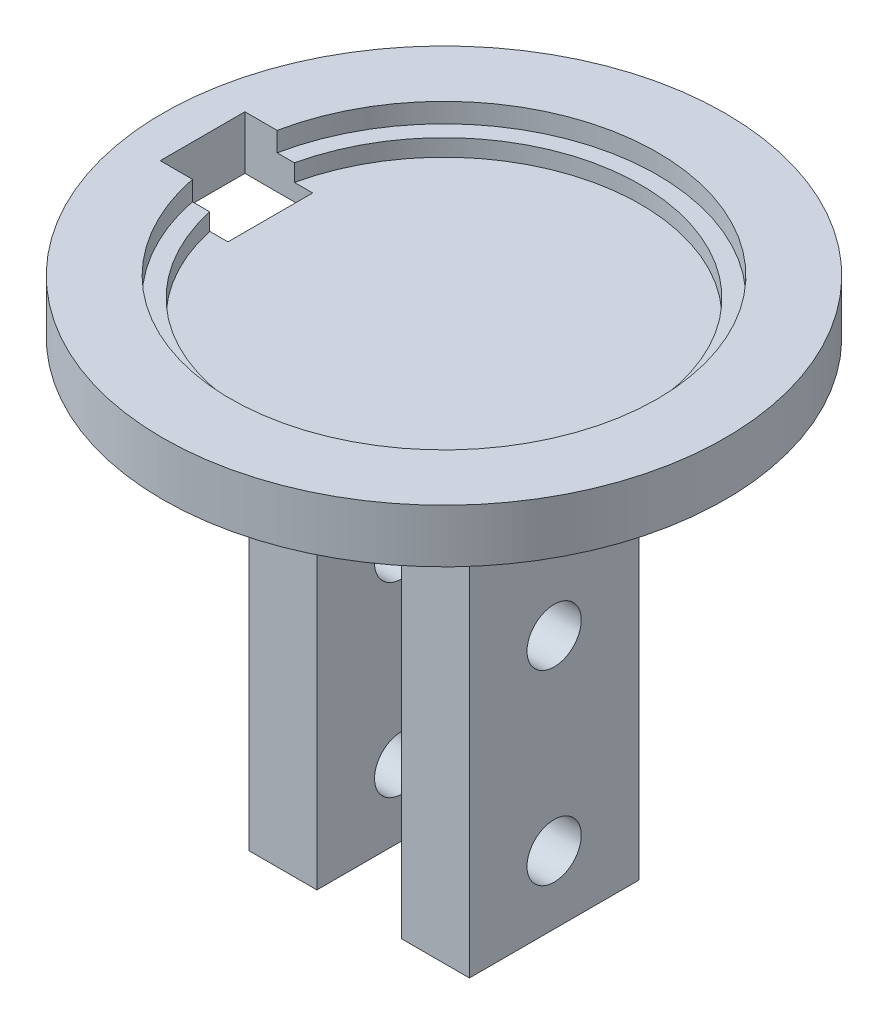
ISO-10303-21;
HEADER;
FILE_DESCRIPTION(('STEP AP214'),'2;1');
FILE_NAME('part.step','',(''),(''),'','','');
FILE_SCHEMA(('AUTOMOTIVE_DESIGN { 1 0 10303 214 1 1 1 1 }'));
ENDSEC;
DATA;
#1=APPLICATION_CONTEXT('core data for automotive mechanical design processes');
#2=APPLICATION_PROTOCOL_DEFINITION('international standard','automotive_design',2000,#1);
#3=PRODUCT_CONTEXT('',#1,'mechanical');
#4=PRODUCT('Part','Part','',(#3));
#5=PRODUCT_RELATED_PRODUCT_CATEGORY('part','',(#4));
#6=PRODUCT_DEFINITION_FORMATION('','',#4);
#7=PRODUCT_DEFINITION_CONTEXT('part definition',#1,'design');
#8=PRODUCT_DEFINITION('design','',#6,#7);
#9=PRODUCT_DEFINITION_SHAPE('','',#8);
#10=(LENGTH_UNIT() NAMED_UNIT(*) SI_UNIT(.MILLI.,.METRE.));
#11=(NAMED_UNIT(*) PLANE_ANGLE_UNIT() SI_UNIT($,.RADIAN.));
#12=(NAMED_UNIT(*) SI_UNIT($,.STERADIAN.) SOLID_ANGLE_UNIT());
#13=UNCERTAINTY_MEASURE_WITH_UNIT(LENGTH_MEASURE(1.E-05),#10,'distance_accuracy_value','');
#14=(GEOMETRIC_REPRESENTATION_CONTEXT(3) GLOBAL_UNCERTAINTY_ASSIGNED_CONTEXT((#13)) GLOBAL_UNIT_ASSIGNED_CONTEXT((#10,
#11,#12)) REPRESENTATION_CONTEXT('',''));
#15=CARTESIAN_POINT('',(0.,0.,0.));
#16=DIRECTION('',(0.,0.,1.));
#17=DIRECTION('',(1.,0.,0.));
#18=AXIS2_PLACEMENT_3D('',#15,#16,#17);
#19=CARTESIAN_POINT('',(-14.45,-6.492,0.));
#20=DIRECTION('',(0.,1.,0.));
#21=DIRECTION('',(0.,0.,1.));
#22=AXIS2_PLACEMENT_3D('',#19,#20,#21);
#23=PLANE('',#22);
#24=DIRECTION('',(-1.,0.,0.));
#25=VECTOR('',#24,1.);
#26=CARTESIAN_POINT('',(-12.1,-6.492,2.5));
#27=LINE('',#26,#25);
#28=CARTESIAN_POINT('',(-8.1,-6.492,2.5));
#29=VERTEX_POINT('',#28);
#30=CARTESIAN_POINT('',(-12.1,-6.492,2.5));
#31=VERTEX_POINT('',#30);
#32=EDGE_CURVE('E198',#29,#31,#27,.T.);
#33=ORIENTED_EDGE('',*,*,#32,.F.);
#34=DIRECTION('',(0.,0.,1.));
#35=VECTOR('',#34,1.);
#36=CARTESIAN_POINT('',(-8.1,-6.492,-2.5));
#37=LINE('',#36,#35);
#38=CARTESIAN_POINT('',(-8.1,-6.492,-2.5));
#39=VERTEX_POINT('',#38);
#40=EDGE_CURVE('E57',#39,#29,#37,.T.);
#41=ORIENTED_EDGE('',*,*,#40,.F.);
#42=DIRECTION('',(1.,0.,0.));
#43=VECTOR('',#42,1.);
#44=CARTESIAN_POINT('',(-12.1,-6.492,-2.5));
#45=LINE('',#44,#43);
#46=CARTESIAN_POINT('',(-12.1,-6.492,-2.5));
#47=VERTEX_POINT('',#46);
#48=EDGE_CURVE('E205',#47,#39,#45,.T.);
#49=ORIENTED_EDGE('',*,*,#48,.F.);
#50=DIRECTION('',(0.,0.,-1.));
#51=VECTOR('',#50,1.);
#52=CARTESIAN_POINT('',(-12.1,-6.492,-2.5));
#53=LINE('',#52,#51);
#54=EDGE_CURVE('E188',#31,#47,#53,.T.);
#55=ORIENTED_EDGE('',*,*,#54,.F.);
#56=EDGE_LOOP('',(#33,#41,#49,#55));
#57=FACE_BOUND('',#56,.T.);
#58=DIRECTION('',(-1.,0.,0.));
#59=VECTOR('',#58,1.);
#60=CARTESIAN_POINT('',(8.65,-6.492,7.75));
#61=LINE('',#60,#59);
#62=CARTESIAN_POINT('',(1.9,-6.492,7.75));
#63=VERTEX_POINT('',#62);
#64=CARTESIAN_POINT('',(2.4,-6.492,7.75));
#65=VERTEX_POINT('',#64);
#66=EDGE_CURVE('E377',#63,#65,#61,.F.);
#67=ORIENTED_EDGE('',*,*,#66,.T.);
#68=DIRECTION('',(-1.,0.,0.));
#69=VECTOR('',#68,1.);
#70=CARTESIAN_POINT('',(8.65,-6.492,7.75));
#71=LINE('',#70,#69);
#72=CARTESIAN_POINT('',(11.4,-6.492,7.75));
#73=VERTEX_POINT('',#72);
#74=EDGE_CURVE('E393',#65,#73,#71,.F.);
#75=ORIENTED_EDGE('',*,*,#74,.T.);
#76=DIRECTION('',(0.,0.,1.));
#77=VECTOR('',#76,1.);
#78=CARTESIAN_POINT('',(11.4,-6.492,-5.));
#79=LINE('',#78,#77);
#80=CARTESIAN_POINT('',(11.4,-6.492,-7.75));
#81=VERTEX_POINT('',#80);
#82=EDGE_CURVE('E390',#73,#81,#79,.F.);
#83=ORIENTED_EDGE('',*,*,#82,.T.);
#84=DIRECTION('',(1.,0.,0.));
#85=VECTOR('',#84,1.);
#86=CARTESIAN_POINT('',(4.65,-6.492,-7.75));
#87=LINE('',#86,#85);
#88=CARTESIAN_POINT('',(2.4,-6.492,-7.75));
#89=VERTEX_POINT('',#88);
#90=EDGE_CURVE('E387',#81,#89,#87,.F.);
#91=ORIENTED_EDGE('',*,*,#90,.T.);
#92=DIRECTION('',(1.,0.,0.));
#93=VECTOR('',#92,1.);
#94=CARTESIAN_POINT('',(4.65,-6.492,-7.75));
#95=LINE('',#94,#93);
#96=CARTESIAN_POINT('',(1.9,-6.492,-7.75));
#97=VERTEX_POINT('',#96);
#98=EDGE_CURVE('E383',#89,#97,#95,.F.);
#99=ORIENTED_EDGE('',*,*,#98,.T.);
#100=DIRECTION('',(1.,0.,0.));
#101=VECTOR('',#100,1.);
#102=CARTESIAN_POINT('',(-4.35,-6.492,-7.75));
#103=LINE('',#102,#101);
#104=CARTESIAN_POINT('',(-7.1,-6.492,-7.75));
#105=VERTEX_POINT('',#104);
#106=EDGE_CURVE('E380',#97,#105,#103,.F.);
#107=ORIENTED_EDGE('',*,*,#106,.T.);
#108=DIRECTION('',(0.,0.,-1.));
#109=VECTOR('',#108,1.);
#110=CARTESIAN_POINT('',(-7.1,-6.492,5.));
#111=LINE('',#110,#109);
#112=CARTESIAN_POINT('',(-7.1,-6.492,7.75));
#113=VERTEX_POINT('',#112);
#114=EDGE_CURVE('E371',#105,#113,#111,.F.);
#115=ORIENTED_EDGE('',*,*,#114,.T.);
#116=DIRECTION('',(-1.,0.,0.));
#117=VECTOR('',#116,1.);
#118=CARTESIAN_POINT('',(-0.350000000000001,-6.492,7.75));
#119=LINE('',#118,#117);
#120=EDGE_CURVE('E374',#113,#63,#119,.F.);
#121=ORIENTED_EDGE('',*,*,#120,.T.);
#122=EDGE_LOOP('',(#67,#75,#83,#91,#99,#107,#115,#121));
#123=FACE_BOUND('',#122,.T.);
#124=CARTESIAN_POINT('',(2.15,-6.492,0.));
#125=DIRECTION('',(0.,-1.,0.));
#126=DIRECTION('',(0.,0.,-1.));
#127=AXIS2_PLACEMENT_3D('',#124,#125,#126);
#128=CIRCLE('',#127,16.6);
#129=CARTESIAN_POINT('',(2.15,-6.492,-16.6));
#130=VERTEX_POINT('',#129);
#131=EDGE_CURVE('E357',#130,#130,#128,.T.);
#132=ORIENTED_EDGE('',*,*,#131,.T.);
#133=EDGE_LOOP('',(#132));
#134=FACE_BOUND('',#133,.T.);
#135=ADVANCED_FACE('F41',(#57,#123,#134),#23,.F.);
#136=CARTESIAN_POINT('',(2.15,-6.492,0.));
#137=DIRECTION('',(0.,-1.,0.));
#138=DIRECTION('',(0.,0.,-1.));
#139=AXIS2_PLACEMENT_3D('',#136,#137,#138);
#140=CYLINDRICAL_SURFACE('',#139,16.6);
#141=ORIENTED_EDGE('',*,*,#131,.F.);
#142=EDGE_LOOP('',(#141));
#143=FACE_BOUND('',#142,.T.);
#144=CARTESIAN_POINT('',(2.15,-3.342,0.));
#145=DIRECTION('',(0.,-1.,0.));
#146=DIRECTION('',(0.,0.,-1.));
#147=AXIS2_PLACEMENT_3D('',#144,#145,#146);
#148=CIRCLE('',#147,16.6);
#149=CARTESIAN_POINT('',(2.15,-3.342,-16.6));
#150=VERTEX_POINT('',#149);
#151=EDGE_CURVE('E337',#150,#150,#148,.T.);
#152=ORIENTED_EDGE('',*,*,#151,.T.);
#153=EDGE_LOOP('',(#152));
#154=FACE_BOUND('',#153,.T.);
#155=ADVANCED_FACE('F499',(#143,#154),#140,.T.);
#156=CARTESIAN_POINT('',(-9.45,-5.492,0.));
#157=DIRECTION('',(0.,-1.,0.));
#158=DIRECTION('',(0.,0.,-1.));
#159=AXIS2_PLACEMENT_3D('',#156,#157,#158);
#160=PLANE('',#159);
#161=CARTESIAN_POINT('',(2.15,-5.492,0.));
#162=DIRECTION('',(0.,-1.,0.));
#163=DIRECTION('',(0.,0.,-1.));
#164=AXIS2_PLACEMENT_3D('',#161,#162,#163);
#165=CIRCLE('',#164,11.6);
#166=CARTESIAN_POINT('',(-9.17740040786058,-5.492,-2.5));
#167=VERTEX_POINT('',#166);
#168=CARTESIAN_POINT('',(-9.17740040786058,-5.492,2.5));
#169=VERTEX_POINT('',#168);
#170=EDGE_CURVE('E353',#167,#169,#165,.T.);
#171=ORIENTED_EDGE('',*,*,#170,.F.);
#172=DIRECTION('',(1.,0.,0.));
#173=VECTOR('',#172,1.);
#174=CARTESIAN_POINT('',(-9.45,-5.492,-2.5));
#175=LINE('',#174,#173);
#176=CARTESIAN_POINT('',(-8.1,-5.492,-2.5));
#177=VERTEX_POINT('',#176);
#178=EDGE_CURVE('E247',#167,#177,#175,.T.);
#179=ORIENTED_EDGE('',*,*,#178,.T.);
#180=DIRECTION('',(0.,0.,1.));
#181=VECTOR('',#180,1.);
#182=CARTESIAN_POINT('',(-8.1,-5.492,0.));
#183=LINE('',#182,#181);
#184=CARTESIAN_POINT('',(-8.1,-5.492,2.5));
#185=VERTEX_POINT('',#184);
#186=EDGE_CURVE('E11',#177,#185,#183,.T.);
#187=ORIENTED_EDGE('',*,*,#186,.T.);
#188=DIRECTION('',(-1.,0.,0.));
#189=VECTOR('',#188,1.);
#190=CARTESIAN_POINT('',(-9.45,-5.492,2.5));
#191=LINE('',#190,#189);
#192=EDGE_CURVE('E231',#185,#169,#191,.T.);
#193=ORIENTED_EDGE('',*,*,#192,.T.);
#194=EDGE_LOOP('',(#171,#179,#187,#193));
#195=FACE_BOUND('',#194,.T.);
#196=ADVANCED_FACE('F484',(#195),#160,.F.);
#197=CARTESIAN_POINT('',(2.15,-6.492,0.));
#198=DIRECTION('',(0.,-1.,0.));
#199=DIRECTION('',(0.,0.,-1.));
#200=AXIS2_PLACEMENT_3D('',#197,#198,#199);
#201=CYLINDRICAL_SURFACE('',#200,11.6);
#202=CARTESIAN_POINT('',(2.15,-4.492,0.));
#203=DIRECTION('',(0.,-1.,0.));
#204=DIRECTION('',(0.,0.,-1.));
#205=AXIS2_PLACEMENT_3D('',#202,#203,#204);
#206=CIRCLE('',#205,11.6);
#207=CARTESIAN_POINT('',(-9.17740040786058,-4.492,-2.5));
#208=VERTEX_POINT('',#207);
#209=CARTESIAN_POINT('',(-9.17740040786058,-4.492,2.5));
#210=VERTEX_POINT('',#209);
#211=EDGE_CURVE('E349',#208,#210,#206,.T.);
#212=ORIENTED_EDGE('',*,*,#211,.F.);
#213=DIRECTION('',(0.,-1.,0.));
#214=VECTOR('',#213,1.);
#215=CARTESIAN_POINT('',(-9.17740040786058,-6.492,-2.5));
#216=LINE('',#215,#214);
#217=EDGE_CURVE('E243',#208,#167,#216,.T.);
#218=ORIENTED_EDGE('',*,*,#217,.T.);
#219=ORIENTED_EDGE('',*,*,#170,.T.);
#220=DIRECTION('',(0.,-1.,0.));
#221=VECTOR('',#220,1.);
#222=CARTESIAN_POINT('',(-9.17740040786058,-6.492,2.5));
#223=LINE('',#222,#221);
#224=EDGE_CURVE('E227',#169,#210,#223,.F.);
#225=ORIENTED_EDGE('',*,*,#224,.T.);
#226=EDGE_LOOP('',(#212,#218,#219,#225));
#227=FACE_BOUND('',#226,.T.);
#228=ADVANCED_FACE('F481',(#227),#201,.F.);
#229=CARTESIAN_POINT('',(-10.45,-4.492,0.));
#230=DIRECTION('',(0.,-1.,0.));
#231=DIRECTION('',(0.,0.,-1.));
#232=AXIS2_PLACEMENT_3D('',#229,#230,#231);
#233=PLANE('',#232);
#234=CARTESIAN_POINT('',(2.15,-4.492,0.));
#235=DIRECTION('',(0.,-1.,0.));
#236=DIRECTION('',(0.,0.,-1.));
#237=AXIS2_PLACEMENT_3D('',#234,#235,#236);
#238=CIRCLE('',#237,12.6);
#239=CARTESIAN_POINT('',(-10.1994939167563,-4.492,-2.5));
#240=VERTEX_POINT('',#239);
#241=CARTESIAN_POINT('',(-10.1994939167563,-4.492,2.5));
#242=VERTEX_POINT('',#241);
#243=EDGE_CURVE('E345',#240,#242,#238,.T.);
#244=ORIENTED_EDGE('',*,*,#243,.F.);
#245=DIRECTION('',(1.,0.,0.));
#246=VECTOR('',#245,1.);
#247=CARTESIAN_POINT('',(-10.45,-4.492,-2.5));
#248=LINE('',#247,#246);
#249=EDGE_CURVE('E239',#240,#208,#248,.T.);
#250=ORIENTED_EDGE('',*,*,#249,.T.);
#251=ORIENTED_EDGE('',*,*,#211,.T.);
#252=DIRECTION('',(-1.,0.,0.));
#253=VECTOR('',#252,1.);
#254=CARTESIAN_POINT('',(-10.45,-4.492,2.5));
#255=LINE('',#254,#253);
#256=EDGE_CURVE('E223',#210,#242,#255,.T.);
#257=ORIENTED_EDGE('',*,*,#256,.T.);
#258=EDGE_LOOP('',(#244,#250,#251,#257));
#259=FACE_BOUND('',#258,.T.);
#260=ADVANCED_FACE('F478',(#259),#233,.F.);
#261=CARTESIAN_POINT('',(2.15,-6.492,0.));
#262=DIRECTION('',(0.,-1.,0.));
#263=DIRECTION('',(0.,0.,-1.));
#264=AXIS2_PLACEMENT_3D('',#261,#262,#263);
#265=CYLINDRICAL_SURFACE('',#264,12.6);
#266=CARTESIAN_POINT('',(2.15,-3.342,0.));
#267=DIRECTION('',(0.,-1.,0.));
#268=DIRECTION('',(0.,0.,-1.));
#269=AXIS2_PLACEMENT_3D('',#266,#267,#268);
#270=CIRCLE('',#269,12.6);
#271=CARTESIAN_POINT('',(-10.1994939167563,-3.342,-2.5));
#272=VERTEX_POINT('',#271);
#273=CARTESIAN_POINT('',(-10.1994939167563,-3.342,2.5));
#274=VERTEX_POINT('',#273);
#275=EDGE_CURVE('E341',#272,#274,#270,.T.);
#276=ORIENTED_EDGE('',*,*,#275,.F.);
#277=DIRECTION('',(0.,-1.,0.));
#278=VECTOR('',#277,1.);
#279=CARTESIAN_POINT('',(-10.1994939167563,-6.492,-2.5));
#280=LINE('',#279,#278);
#281=EDGE_CURVE('E235',#272,#240,#280,.T.);
#282=ORIENTED_EDGE('',*,*,#281,.T.);
#283=ORIENTED_EDGE('',*,*,#243,.T.);
#284=DIRECTION('',(0.,-1.,0.));
#285=VECTOR('',#284,1.);
#286=CARTESIAN_POINT('',(-10.1994939167563,-6.492,2.5));
#287=LINE('',#286,#285);
#288=EDGE_CURVE('E215',#242,#274,#287,.F.);
#289=ORIENTED_EDGE('',*,*,#288,.T.);
#290=EDGE_LOOP('',(#276,#282,#283,#289));
#291=FACE_BOUND('',#290,.T.);
#292=ADVANCED_FACE('F475',(#291),#265,.F.);
#293=CARTESIAN_POINT('',(-14.45,-3.342,0.));
#294=DIRECTION('',(0.,-1.,0.));
#295=DIRECTION('',(0.,0.,-1.));
#296=AXIS2_PLACEMENT_3D('',#293,#294,#295);
#297=PLANE('',#296);
#298=ORIENTED_EDGE('',*,*,#151,.F.);
#299=EDGE_LOOP('',(#298));
#300=FACE_BOUND('',#299,.T.);
#301=DIRECTION('',(0.,0.,-1.));
#302=VECTOR('',#301,1.);
#303=CARTESIAN_POINT('',(-12.1,-3.342,0.));
#304=LINE('',#303,#302);
#305=CARTESIAN_POINT('',(-12.1,-3.342,2.5));
#306=VERTEX_POINT('',#305);
#307=CARTESIAN_POINT('',(-12.1,-3.342,-2.5));
#308=VERTEX_POINT('',#307);
#309=EDGE_CURVE('E191',#306,#308,#304,.T.);
#310=ORIENTED_EDGE('',*,*,#309,.T.);
#311=DIRECTION('',(1.,0.,0.));
#312=VECTOR('',#311,1.);
#313=CARTESIAN_POINT('',(-14.45,-3.342,-2.5));
#314=LINE('',#313,#312);
#315=EDGE_CURVE('E50',#308,#272,#314,.T.);
#316=ORIENTED_EDGE('',*,*,#315,.T.);
#317=ORIENTED_EDGE('',*,*,#275,.T.);
#318=DIRECTION('',(-1.,0.,0.));
#319=VECTOR('',#318,1.);
#320=CARTESIAN_POINT('',(-14.45,-3.342,2.5));
#321=LINE('',#320,#319);
#322=EDGE_CURVE('E418',#274,#306,#321,.T.);
#323=ORIENTED_EDGE('',*,*,#322,.T.);
#324=EDGE_LOOP('',(#310,#316,#317,#323));
#325=FACE_BOUND('',#324,.T.);
#326=ADVANCED_FACE('F472',(#300,#325),#297,.F.);
#327=CARTESIAN_POINT('',(-4.35,-33.492,5.));
#328=DIRECTION('',(1.,0.,0.));
#329=DIRECTION('',(0.,0.,-1.));
#330=AXIS2_PLACEMENT_3D('',#327,#328,#329);
#331=PLANE('',#330);
#332=CARTESIAN_POINT('',(-4.35,-29.492,0.));
#333=DIRECTION('',(-1.,0.,0.));
#334=DIRECTION('',(0.,0.,1.));
#335=AXIS2_PLACEMENT_3D('',#332,#333,#334);
#336=CIRCLE('',#335,1.6);
#337=CARTESIAN_POINT('',(-4.35,-29.492,1.6));
#338=VERTEX_POINT('',#337);
#339=EDGE_CURVE('E252',#338,#338,#336,.T.);
#340=ORIENTED_EDGE('',*,*,#339,.F.);
#341=EDGE_LOOP('',(#340));
#342=FACE_BOUND('',#341,.T.);
#343=CARTESIAN_POINT('',(-4.35,-18.492,0.));
#344=DIRECTION('',(-1.,0.,0.));
#345=DIRECTION('',(0.,0.,1.));
#346=AXIS2_PLACEMENT_3D('',#343,#344,#345);
#347=CIRCLE('',#346,1.6);
#348=CARTESIAN_POINT('',(-4.35,-18.492,1.6));
#349=VERTEX_POINT('',#348);
#350=EDGE_CURVE('E257',#349,#349,#347,.T.);
#351=ORIENTED_EDGE('',*,*,#350,.F.);
#352=EDGE_LOOP('',(#351));
#353=FACE_BOUND('',#352,.T.);
#354=DIRECTION('',(0.,1.,0.));
#355=VECTOR('',#354,1.);
#356=CARTESIAN_POINT('',(-4.35,-33.492,5.));
#357=LINE('',#356,#355);
#358=CARTESIAN_POINT('',(-4.35,-33.492,5.));
#359=VERTEX_POINT('',#358);
#360=CARTESIAN_POINT('',(-4.35,-9.242,5.));
#361=VERTEX_POINT('',#360);
#362=EDGE_CURVE('E321',#359,#361,#357,.T.);
#363=ORIENTED_EDGE('',*,*,#362,.T.);
#364=DIRECTION('',(0.,0.,-1.));
#365=VECTOR('',#364,1.);
#366=CARTESIAN_POINT('',(-4.35,-9.242,-5.));
#367=LINE('',#366,#365);
#368=CARTESIAN_POINT('',(-4.35,-9.242,-5.));
#369=VERTEX_POINT('',#368);
#370=EDGE_CURVE('E415',#361,#369,#367,.T.);
#371=ORIENTED_EDGE('',*,*,#370,.T.);
#372=DIRECTION('',(0.,1.,0.));
#373=VECTOR('',#372,1.);
#374=CARTESIAN_POINT('',(-4.35,-33.492,-5.));
#375=LINE('',#374,#373);
#376=CARTESIAN_POINT('',(-4.35,-33.492,-5.));
#377=VERTEX_POINT('',#376);
#378=EDGE_CURVE('E333',#377,#369,#375,.T.);
#379=ORIENTED_EDGE('',*,*,#378,.F.);
#380=DIRECTION('',(0.,0.,-1.));
#381=VECTOR('',#380,1.);
#382=CARTESIAN_POINT('',(-4.35,-33.492,5.));
#383=LINE('',#382,#381);
#384=EDGE_CURVE('E308',#359,#377,#383,.T.);
#385=ORIENTED_EDGE('',*,*,#384,.F.);
#386=EDGE_LOOP('',(#363,#371,#379,#385));
#387=FACE_BOUND('',#386,.T.);
#388=ADVANCED_FACE('F584',(#342,#353,#387),#331,.F.);
#389=CARTESIAN_POINT('',(-4.35,-33.492,-5.));
#390=DIRECTION('',(0.,0.,1.));
#391=DIRECTION('',(1.,0.,0.));
#392=AXIS2_PLACEMENT_3D('',#389,#390,#391);
#393=PLANE('',#392);
#394=ORIENTED_EDGE('',*,*,#378,.T.);
#395=DIRECTION('',(1.,0.,0.));
#396=VECTOR('',#395,1.);
#397=CARTESIAN_POINT('',(-0.35,-9.242,-5.));
#398=LINE('',#397,#396);
#399=CARTESIAN_POINT('',(-0.35,-9.242,-5.));
#400=VERTEX_POINT('',#399);
#401=EDGE_CURVE('E396',#369,#400,#398,.T.);
#402=ORIENTED_EDGE('',*,*,#401,.T.);
#403=DIRECTION('',(0.,1.,0.));
#404=VECTOR('',#403,1.);
#405=CARTESIAN_POINT('',(-0.35,-33.492,-5.));
#406=LINE('',#405,#404);
#407=CARTESIAN_POINT('',(-0.35,-33.492,-5.));
#408=VERTEX_POINT('',#407);
#409=EDGE_CURVE('E329',#408,#400,#406,.T.);
#410=ORIENTED_EDGE('',*,*,#409,.F.);
#411=DIRECTION('',(1.,0.,0.));
#412=VECTOR('',#411,1.);
#413=CARTESIAN_POINT('',(-4.35,-33.492,-5.));
#414=LINE('',#413,#412);
#415=EDGE_CURVE('E312',#377,#408,#414,.T.);
#416=ORIENTED_EDGE('',*,*,#415,.F.);
#417=EDGE_LOOP('',(#394,#402,#410,#416));
#418=FACE_BOUND('',#417,.T.);
#419=ADVANCED_FACE('F572',(#418),#393,.F.);
#420=CARTESIAN_POINT('',(-0.350000000000002,-33.492,5.));
#421=DIRECTION('',(-1.,0.,0.));
#422=DIRECTION('',(0.,0.,1.));
#423=AXIS2_PLACEMENT_3D('',#420,#421,#422);
#424=PLANE('',#423);
#425=CARTESIAN_POINT('',(-0.350000000000003,-29.492,0.));
#426=DIRECTION('',(-1.,0.,0.));
#427=DIRECTION('',(0.,0.,1.));
#428=AXIS2_PLACEMENT_3D('',#425,#426,#427);
#429=CIRCLE('',#428,1.6);
#430=CARTESIAN_POINT('',(-0.350000000000003,-29.492,1.6));
#431=VERTEX_POINT('',#430);
#432=EDGE_CURVE('E275',#431,#431,#429,.T.);
#433=ORIENTED_EDGE('',*,*,#432,.T.);
#434=EDGE_LOOP('',(#433));
#435=FACE_BOUND('',#434,.T.);
#436=CARTESIAN_POINT('',(-0.350000000000003,-18.492,0.));
#437=DIRECTION('',(-1.,0.,0.));
#438=DIRECTION('',(0.,0.,1.));
#439=AXIS2_PLACEMENT_3D('',#436,#437,#438);
#440=CIRCLE('',#439,1.6);
#441=CARTESIAN_POINT('',(-0.350000000000003,-18.492,1.6));
#442=VERTEX_POINT('',#441);
#443=EDGE_CURVE('E266',#442,#442,#440,.T.);
#444=ORIENTED_EDGE('',*,*,#443,.T.);
#445=EDGE_LOOP('',(#444));
#446=FACE_BOUND('',#445,.T.);
#447=ORIENTED_EDGE('',*,*,#409,.T.);
#448=DIRECTION('',(0.,0.,1.));
#449=VECTOR('',#448,1.);
#450=CARTESIAN_POINT('',(-0.350000000000002,-9.242,5.));
#451=LINE('',#450,#449);
#452=CARTESIAN_POINT('',(-0.350000000000002,-9.242,5.));
#453=VERTEX_POINT('',#452);
#454=EDGE_CURVE('E412',#400,#453,#451,.T.);
#455=ORIENTED_EDGE('',*,*,#454,.T.);
#456=DIRECTION('',(0.,1.,0.));
#457=VECTOR('',#456,1.);
#458=CARTESIAN_POINT('',(-0.350000000000002,-33.492,5.));
#459=LINE('',#458,#457);
#460=CARTESIAN_POINT('',(-0.350000000000002,-33.492,5.));
#461=VERTEX_POINT('',#460);
#462=EDGE_CURVE('E325',#461,#453,#459,.T.);
#463=ORIENTED_EDGE('',*,*,#462,.F.);
#464=DIRECTION('',(0.,0.,1.));
#465=VECTOR('',#464,1.);
#466=CARTESIAN_POINT('',(-0.350000000000002,-33.492,5.));
#467=LINE('',#466,#465);
#468=EDGE_CURVE('E315',#408,#461,#467,.T.);
#469=ORIENTED_EDGE('',*,*,#468,.F.);
#470=EDGE_LOOP('',(#447,#455,#463,#469));
#471=FACE_BOUND('',#470,.T.);
#472=ADVANCED_FACE('F576',(#435,#446,#471),#424,.F.);
#473=CARTESIAN_POINT('',(-4.35,-33.492,5.));
#474=DIRECTION('',(0.,0.,-1.));
#475=DIRECTION('',(-1.,0.,0.));
#476=AXIS2_PLACEMENT_3D('',#473,#474,#475);
#477=PLANE('',#476);
#478=ORIENTED_EDGE('',*,*,#462,.T.);
#479=DIRECTION('',(-1.,0.,0.));
#480=VECTOR('',#479,1.);
#481=CARTESIAN_POINT('',(-4.35,-9.242,5.));
#482=LINE('',#481,#480);
#483=EDGE_CURVE('E403',#453,#361,#482,.T.);
#484=ORIENTED_EDGE('',*,*,#483,.T.);
#485=ORIENTED_EDGE('',*,*,#362,.F.);
#486=DIRECTION('',(-1.,0.,0.));
#487=VECTOR('',#486,1.);
#488=CARTESIAN_POINT('',(-4.35,-33.492,5.));
#489=LINE('',#488,#487);
#490=EDGE_CURVE('E318',#461,#359,#489,.T.);
#491=ORIENTED_EDGE('',*,*,#490,.F.);
#492=EDGE_LOOP('',(#478,#484,#485,#491));
#493=FACE_BOUND('',#492,.T.);
#494=ADVANCED_FACE('F617',(#493),#477,.F.);
#495=CARTESIAN_POINT('',(0.,-33.492,0.));
#496=DIRECTION('',(0.,-1.,0.));
#497=DIRECTION('',(0.,0.,-1.));
#498=AXIS2_PLACEMENT_3D('',#495,#496,#497);
#499=PLANE('',#498);
#500=ORIENTED_EDGE('',*,*,#384,.T.);
#501=ORIENTED_EDGE('',*,*,#415,.T.);
#502=ORIENTED_EDGE('',*,*,#468,.T.);
#503=ORIENTED_EDGE('',*,*,#490,.T.);
#504=EDGE_LOOP('',(#500,#501,#502,#503));
#505=FACE_BOUND('',#504,.T.);
#506=ADVANCED_FACE('F580',(#505),#499,.T.);
#507=CARTESIAN_POINT('',(8.65,-33.492,5.));
#508=DIRECTION('',(-1.,0.,0.));
#509=DIRECTION('',(0.,0.,1.));
#510=AXIS2_PLACEMENT_3D('',#507,#508,#509);
#511=PLANE('',#510);
#512=CARTESIAN_POINT('',(8.65,-29.492,0.));
#513=DIRECTION('',(-1.,0.,0.));
#514=DIRECTION('',(0.,0.,1.));
#515=AXIS2_PLACEMENT_3D('',#512,#513,#514);
#516=CIRCLE('',#515,1.6);
#517=CARTESIAN_POINT('',(8.65,-29.492,1.6));
#518=VERTEX_POINT('',#517);
#519=EDGE_CURVE('E271',#518,#518,#516,.T.);
#520=ORIENTED_EDGE('',*,*,#519,.T.);
#521=EDGE_LOOP('',(#520));
#522=FACE_BOUND('',#521,.T.);
#523=CARTESIAN_POINT('',(8.65,-18.492,0.));
#524=DIRECTION('',(-1.,0.,0.));
#525=DIRECTION('',(0.,0.,1.));
#526=AXIS2_PLACEMENT_3D('',#523,#524,#525);
#527=CIRCLE('',#526,1.6);
#528=CARTESIAN_POINT('',(8.65,-18.492,1.6));
#529=VERTEX_POINT('',#528);
#530=EDGE_CURVE('E262',#529,#529,#527,.T.);
#531=ORIENTED_EDGE('',*,*,#530,.T.);
#532=EDGE_LOOP('',(#531));
#533=FACE_BOUND('',#532,.T.);
#534=DIRECTION('',(0.,1.,0.));
#535=VECTOR('',#534,1.);
#536=CARTESIAN_POINT('',(8.65,-33.492,-5.));
#537=LINE('',#536,#535);
#538=CARTESIAN_POINT('',(8.65,-33.492,-5.));
#539=VERTEX_POINT('',#538);
#540=CARTESIAN_POINT('',(8.65,-9.242,-5.));
#541=VERTEX_POINT('',#540);
#542=EDGE_CURVE('E292',#539,#541,#537,.T.);
#543=ORIENTED_EDGE('',*,*,#542,.T.);
#544=DIRECTION('',(0.,0.,1.));
#545=VECTOR('',#544,1.);
#546=CARTESIAN_POINT('',(8.65,-9.242,5.));
#547=LINE('',#546,#545);
#548=CARTESIAN_POINT('',(8.65,-9.242,5.));
#549=VERTEX_POINT('',#548);
#550=EDGE_CURVE('E406',#541,#549,#547,.T.);
#551=ORIENTED_EDGE('',*,*,#550,.T.);
#552=DIRECTION('',(0.,1.,0.));
#553=VECTOR('',#552,1.);
#554=CARTESIAN_POINT('',(8.65,-33.492,5.));
#555=LINE('',#554,#553);
#556=CARTESIAN_POINT('',(8.65,-33.492,5.));
#557=VERTEX_POINT('',#556);
#558=EDGE_CURVE('E304',#557,#549,#555,.T.);
#559=ORIENTED_EDGE('',*,*,#558,.F.);
#560=DIRECTION('',(0.,0.,1.));
#561=VECTOR('',#560,1.);
#562=CARTESIAN_POINT('',(8.65,-33.492,5.));
#563=LINE('',#562,#561);
#564=EDGE_CURVE('E279',#539,#557,#563,.T.);
#565=ORIENTED_EDGE('',*,*,#564,.F.);
#566=EDGE_LOOP('',(#543,#551,#559,#565));
#567=FACE_BOUND('',#566,.T.);
#568=ADVANCED_FACE('F608',(#522,#533,#567),#511,.F.);
#569=CARTESIAN_POINT('',(8.65,-33.492,5.));
#570=DIRECTION('',(0.,0.,-1.));
#571=DIRECTION('',(-1.,0.,0.));
#572=AXIS2_PLACEMENT_3D('',#569,#570,#571);
#573=PLANE('',#572);
#574=ORIENTED_EDGE('',*,*,#558,.T.);
#575=DIRECTION('',(-1.,0.,0.));
#576=VECTOR('',#575,1.);
#577=CARTESIAN_POINT('',(4.65,-9.242,5.));
#578=LINE('',#577,#576);
#579=CARTESIAN_POINT('',(4.65,-9.242,5.));
#580=VERTEX_POINT('',#579);
#581=EDGE_CURVE('E400',#549,#580,#578,.T.);
#582=ORIENTED_EDGE('',*,*,#581,.T.);
#583=DIRECTION('',(0.,1.,0.));
#584=VECTOR('',#583,1.);
#585=CARTESIAN_POINT('',(4.65,-33.492,5.));
#586=LINE('',#585,#584);
#587=CARTESIAN_POINT('',(4.65,-33.492,5.));
#588=VERTEX_POINT('',#587);
#589=EDGE_CURVE('E300',#588,#580,#586,.T.);
#590=ORIENTED_EDGE('',*,*,#589,.F.);
#591=DIRECTION('',(-1.,0.,0.));
#592=VECTOR('',#591,1.);
#593=CARTESIAN_POINT('',(8.65,-33.492,5.));
#594=LINE('',#593,#592);
#595=EDGE_CURVE('E283',#557,#588,#594,.T.);
#596=ORIENTED_EDGE('',*,*,#595,.F.);
#597=EDGE_LOOP('',(#574,#582,#590,#596));
#598=FACE_BOUND('',#597,.T.);
#599=ADVANCED_FACE('F602',(#598),#573,.F.);
#600=CARTESIAN_POINT('',(4.65,-33.492,5.));
#601=DIRECTION('',(1.,0.,0.));
#602=DIRECTION('',(0.,0.,-1.));
#603=AXIS2_PLACEMENT_3D('',#600,#601,#602);
#604=PLANE('',#603);
#605=CARTESIAN_POINT('',(4.65,-29.492,0.));
#606=DIRECTION('',(1.,0.,0.));
#607=DIRECTION('',(0.,0.,-1.));
#608=AXIS2_PLACEMENT_3D('',#605,#606,#607);
#609=CIRCLE('',#608,1.6);
#610=CARTESIAN_POINT('',(4.65,-29.492,-1.6));
#611=VERTEX_POINT('',#610);
#612=EDGE_CURVE('E270',#611,#611,#609,.T.);
#613=ORIENTED_EDGE('',*,*,#612,.T.);
#614=EDGE_LOOP('',(#613));
#615=FACE_BOUND('',#614,.T.);
#616=CARTESIAN_POINT('',(4.65,-18.492,0.));
#617=DIRECTION('',(1.,0.,0.));
#618=DIRECTION('',(0.,0.,-1.));
#619=AXIS2_PLACEMENT_3D('',#616,#617,#618);
#620=CIRCLE('',#619,1.6);
#621=CARTESIAN_POINT('',(4.65,-18.492,-1.6));
#622=VERTEX_POINT('',#621);
#623=EDGE_CURVE('E256',#622,#622,#620,.T.);
#624=ORIENTED_EDGE('',*,*,#623,.T.);
#625=EDGE_LOOP('',(#624));
#626=FACE_BOUND('',#625,.T.);
#627=ORIENTED_EDGE('',*,*,#589,.T.);
#628=DIRECTION('',(0.,0.,-1.));
#629=VECTOR('',#628,1.);
#630=CARTESIAN_POINT('',(4.65,-9.242,-5.));
#631=LINE('',#630,#629);
#632=CARTESIAN_POINT('',(4.65,-9.242,-5.));
#633=VERTEX_POINT('',#632);
#634=EDGE_CURVE('E409',#580,#633,#631,.T.);
#635=ORIENTED_EDGE('',*,*,#634,.T.);
#636=DIRECTION('',(0.,1.,0.));
#637=VECTOR('',#636,1.);
#638=CARTESIAN_POINT('',(4.65,-33.492,-5.));
#639=LINE('',#638,#637);
#640=CARTESIAN_POINT('',(4.65,-33.492,-5.));
#641=VERTEX_POINT('',#640);
#642=EDGE_CURVE('E296',#641,#633,#639,.T.);
#643=ORIENTED_EDGE('',*,*,#642,.F.);
#644=DIRECTION('',(0.,0.,-1.));
#645=VECTOR('',#644,1.);
#646=CARTESIAN_POINT('',(4.65,-33.492,5.));
#647=LINE('',#646,#645);
#648=EDGE_CURVE('E286',#588,#641,#647,.T.);
#649=ORIENTED_EDGE('',*,*,#648,.F.);
#650=EDGE_LOOP('',(#627,#635,#643,#649));
#651=FACE_BOUND('',#650,.T.);
#652=ADVANCED_FACE('F590',(#615,#626,#651),#604,.F.);
#653=CARTESIAN_POINT('',(8.65,-33.492,-5.));
#654=DIRECTION('',(0.,0.,1.));
#655=DIRECTION('',(1.,0.,0.));
#656=AXIS2_PLACEMENT_3D('',#653,#654,#655);
#657=PLANE('',#656);
#658=ORIENTED_EDGE('',*,*,#642,.T.);
#659=DIRECTION('',(1.,0.,0.));
#660=VECTOR('',#659,1.);
#661=CARTESIAN_POINT('',(8.65,-9.242,-5.));
#662=LINE('',#661,#660);
#663=EDGE_CURVE('E361',#633,#541,#662,.T.);
#664=ORIENTED_EDGE('',*,*,#663,.T.);
#665=ORIENTED_EDGE('',*,*,#542,.F.);
#666=DIRECTION('',(1.,0.,0.));
#667=VECTOR('',#666,1.);
#668=CARTESIAN_POINT('',(8.65,-33.492,-5.));
#669=LINE('',#668,#667);
#670=EDGE_CURVE('E289',#641,#539,#669,.T.);
#671=ORIENTED_EDGE('',*,*,#670,.F.);
#672=EDGE_LOOP('',(#658,#664,#665,#671));
#673=FACE_BOUND('',#672,.T.);
#674=ADVANCED_FACE('F595',(#673),#657,.F.);
#675=CARTESIAN_POINT('',(0.,-33.492,0.));
#676=DIRECTION('',(0.,1.,0.));
#677=DIRECTION('',(0.,0.,1.));
#678=AXIS2_PLACEMENT_3D('',#675,#676,#677);
#679=PLANE('',#678);
#680=ORIENTED_EDGE('',*,*,#564,.T.);
#681=ORIENTED_EDGE('',*,*,#595,.T.);
#682=ORIENTED_EDGE('',*,*,#648,.T.);
#683=ORIENTED_EDGE('',*,*,#670,.T.);
#684=EDGE_LOOP('',(#680,#681,#682,#683));
#685=FACE_BOUND('',#684,.T.);
#686=ADVANCED_FACE('F599',(#685),#679,.F.);
#687=CARTESIAN_POINT('',(17.95,-18.492,0.));
#688=DIRECTION('',(-1.,0.,0.));
#689=DIRECTION('',(0.,0.,1.));
#690=AXIS2_PLACEMENT_3D('',#687,#688,#689);
#691=CYLINDRICAL_SURFACE('',#690,1.6);
#692=ORIENTED_EDGE('',*,*,#623,.F.);
#693=EDGE_LOOP('',(#692));
#694=FACE_BOUND('',#693,.T.);
#695=ORIENTED_EDGE('',*,*,#530,.F.);
#696=EDGE_LOOP('',(#695));
#697=FACE_BOUND('',#696,.T.);
#698=ADVANCED_FACE('F665',(#694,#697),#691,.F.);
#699=CARTESIAN_POINT('',(17.95,-29.492,0.));
#700=DIRECTION('',(-1.,0.,0.));
#701=DIRECTION('',(0.,0.,1.));
#702=AXIS2_PLACEMENT_3D('',#699,#700,#701);
#703=CYLINDRICAL_SURFACE('',#702,1.6);
#704=ORIENTED_EDGE('',*,*,#612,.F.);
#705=EDGE_LOOP('',(#704));
#706=FACE_BOUND('',#705,.T.);
#707=ORIENTED_EDGE('',*,*,#519,.F.);
#708=EDGE_LOOP('',(#707));
#709=FACE_BOUND('',#708,.T.);
#710=ADVANCED_FACE('F676',(#706,#709),#703,.F.);
#711=ORIENTED_EDGE('',*,*,#350,.T.);
#712=EDGE_LOOP('',(#711));
#713=FACE_BOUND('',#712,.T.);
#714=ORIENTED_EDGE('',*,*,#443,.F.);
#715=EDGE_LOOP('',(#714));
#716=FACE_BOUND('',#715,.T.);
#717=ADVANCED_FACE('F679',(#713,#716),#691,.F.);
#718=ORIENTED_EDGE('',*,*,#339,.T.);
#719=EDGE_LOOP('',(#718));
#720=FACE_BOUND('',#719,.T.);
#721=ORIENTED_EDGE('',*,*,#432,.F.);
#722=EDGE_LOOP('',(#721));
#723=FACE_BOUND('',#722,.T.);
#724=ADVANCED_FACE('F545',(#720,#723),#703,.F.);
#725=CARTESIAN_POINT('',(8.65,-9.242,7.75));
#726=DIRECTION('',(1.,0.,0.));
#727=DIRECTION('',(0.,0.,-1.));
#728=AXIS2_PLACEMENT_3D('',#725,#726,#727);
#729=CYLINDRICAL_SURFACE('',#728,2.75);
#730=CARTESIAN_POINT('',(2.4,-9.242,7.75));
#731=DIRECTION('',(0.707106781186548,0.,-0.707106781186547));
#732=DIRECTION('',(-0.707106781186547,0.,-0.707106781186548));
#733=AXIS2_PLACEMENT_3D('',#730,#731,#732);
#734=ELLIPSE('',#733,3.88908729652601,2.75);
#735=CARTESIAN_POINT('',(2.15,-6.50338721247417,7.5));
#736=VERTEX_POINT('',#735);
#737=EDGE_CURVE('E458',#65,#736,#734,.F.);
#738=ORIENTED_EDGE('',*,*,#737,.F.);
#739=ORIENTED_EDGE('',*,*,#66,.F.);
#740=CARTESIAN_POINT('',(1.9,-9.242,7.75));
#741=DIRECTION('',(0.707106781186547,0.,0.707106781186548));
#742=DIRECTION('',(-0.707106781186548,0.,0.707106781186547));
#743=AXIS2_PLACEMENT_3D('',#740,#741,#742);
#744=ELLIPSE('',#743,3.88908729652601,2.75);
#745=EDGE_CURVE('E261',#736,#63,#744,.T.);
#746=ORIENTED_EDGE('',*,*,#745,.F.);
#747=EDGE_LOOP('',(#738,#739,#746));
#748=FACE_BOUND('',#747,.T.);
#749=ADVANCED_FACE('F43',(#748),#729,.F.);
#750=CARTESIAN_POINT('',(-4.35,-9.242,7.75));
#751=DIRECTION('',(1.,0.,0.));
#752=DIRECTION('',(0.,0.,-1.));
#753=AXIS2_PLACEMENT_3D('',#750,#751,#752);
#754=CYLINDRICAL_SURFACE('',#753,2.75);
#755=ORIENTED_EDGE('',*,*,#745,.T.);
#756=ORIENTED_EDGE('',*,*,#120,.F.);
#757=CARTESIAN_POINT('',(-7.1,-9.242,7.75));
#758=DIRECTION('',(0.707106781186547,0.,0.707106781186548));
#759=DIRECTION('',(-0.707106781186547,0.,0.707106781186547));
#760=AXIS2_PLACEMENT_3D('',#757,#758,#759);
#761=ELLIPSE('',#760,3.88908729652601,2.75);
#762=EDGE_CURVE('E454',#361,#113,#761,.T.);
#763=ORIENTED_EDGE('',*,*,#762,.F.);
#764=ORIENTED_EDGE('',*,*,#483,.F.);
#765=CARTESIAN_POINT('',(2.4,-9.242,7.75));
#766=DIRECTION('',(0.707106781186548,0.,-0.707106781186547));
#767=DIRECTION('',(-0.707106781186547,0.,-0.707106781186548));
#768=AXIS2_PLACEMENT_3D('',#765,#766,#767);
#769=ELLIPSE('',#768,3.88908729652601,2.75);
#770=EDGE_CURVE('E450',#736,#453,#769,.F.);
#771=ORIENTED_EDGE('',*,*,#770,.F.);
#772=EDGE_LOOP('',(#755,#756,#763,#764,#771));
#773=FACE_BOUND('',#772,.T.);
#774=ADVANCED_FACE('F538',(#773),#754,.F.);
#775=CARTESIAN_POINT('',(8.65,-9.242,7.75));
#776=DIRECTION('',(1.,0.,0.));
#777=DIRECTION('',(0.,0.,-1.));
#778=AXIS2_PLACEMENT_3D('',#775,#776,#777);
#779=CYLINDRICAL_SURFACE('',#778,2.75);
#780=ORIENTED_EDGE('',*,*,#74,.F.);
#781=ORIENTED_EDGE('',*,*,#737,.T.);
#782=CARTESIAN_POINT('',(1.9,-9.242,7.75));
#783=DIRECTION('',(0.707106781186547,0.,0.707106781186548));
#784=DIRECTION('',(-0.707106781186548,0.,0.707106781186547));
#785=AXIS2_PLACEMENT_3D('',#782,#783,#784);
#786=ELLIPSE('',#785,3.88908729652601,2.75);
#787=EDGE_CURVE('E443',#580,#736,#786,.T.);
#788=ORIENTED_EDGE('',*,*,#787,.F.);
#789=ORIENTED_EDGE('',*,*,#581,.F.);
#790=CARTESIAN_POINT('',(11.4,-9.242,7.75));
#791=DIRECTION('',(0.707106781186548,0.,-0.707106781186548));
#792=DIRECTION('',(-0.707106781186547,0.,-0.707106781186547));
#793=AXIS2_PLACEMENT_3D('',#790,#791,#792);
#794=ELLIPSE('',#793,3.88908729652601,2.75);
#795=EDGE_CURVE('E439',#73,#549,#794,.F.);
#796=ORIENTED_EDGE('',*,*,#795,.F.);
#797=EDGE_LOOP('',(#780,#781,#788,#789,#796));
#798=FACE_BOUND('',#797,.T.);
#799=ADVANCED_FACE('F535',(#798),#779,.F.);
#800=CARTESIAN_POINT('',(-7.1,-9.242,5.));
#801=DIRECTION('',(0.,0.,1.));
#802=DIRECTION('',(1.,0.,0.));
#803=AXIS2_PLACEMENT_3D('',#800,#801,#802);
#804=CYLINDRICAL_SURFACE('',#803,2.75);
#805=ORIENTED_EDGE('',*,*,#762,.T.);
#806=ORIENTED_EDGE('',*,*,#114,.F.);
#807=CARTESIAN_POINT('',(-7.1,-9.242,-7.75));
#808=DIRECTION('',(-0.707106781186547,0.,0.707106781186547));
#809=DIRECTION('',(0.707106781186547,0.,0.707106781186548));
#810=AXIS2_PLACEMENT_3D('',#807,#808,#809);
#811=ELLIPSE('',#810,3.88908729652601,2.75);
#812=EDGE_CURVE('E435',#369,#105,#811,.T.);
#813=ORIENTED_EDGE('',*,*,#812,.F.);
#814=ORIENTED_EDGE('',*,*,#370,.F.);
#815=EDGE_LOOP('',(#805,#806,#813,#814));
#816=FACE_BOUND('',#815,.T.);
#817=ADVANCED_FACE('F531',(#816),#804,.F.);
#818=CARTESIAN_POINT('',(2.4,-9.242,5.));
#819=DIRECTION('',(0.,0.,-1.));
#820=DIRECTION('',(-1.,0.,0.));
#821=AXIS2_PLACEMENT_3D('',#818,#819,#820);
#822=CYLINDRICAL_SURFACE('',#821,2.75);
#823=DIRECTION('',(0.,0.,-1.));
#824=VECTOR('',#823,1.);
#825=CARTESIAN_POINT('',(2.15,-6.50338721247417,0.));
#826=LINE('',#825,#824);
#827=CARTESIAN_POINT('',(2.15,-6.50338721247417,-7.5));
#828=VERTEX_POINT('',#827);
#829=EDGE_CURVE('E447',#736,#828,#826,.T.);
#830=ORIENTED_EDGE('',*,*,#829,.F.);
#831=ORIENTED_EDGE('',*,*,#770,.T.);
#832=ORIENTED_EDGE('',*,*,#454,.F.);
#833=CARTESIAN_POINT('',(2.4,-9.242,-7.75));
#834=DIRECTION('',(-0.707106781186547,0.,-0.707106781186548));
#835=DIRECTION('',(0.707106781186548,0.,-0.707106781186547));
#836=AXIS2_PLACEMENT_3D('',#833,#834,#835);
#837=ELLIPSE('',#836,3.88908729652601,2.75);
#838=EDGE_CURVE('E432',#828,#400,#837,.F.);
#839=ORIENTED_EDGE('',*,*,#838,.F.);
#840=EDGE_LOOP('',(#830,#831,#832,#839));
#841=FACE_BOUND('',#840,.T.);
#842=ADVANCED_FACE('F527',(#841),#822,.F.);
#843=CARTESIAN_POINT('',(1.9,-9.242,5.));
#844=DIRECTION('',(0.,0.,1.));
#845=DIRECTION('',(1.,0.,0.));
#846=AXIS2_PLACEMENT_3D('',#843,#844,#845);
#847=CYLINDRICAL_SURFACE('',#846,2.75);
#848=ORIENTED_EDGE('',*,*,#787,.T.);
#849=ORIENTED_EDGE('',*,*,#829,.T.);
#850=CARTESIAN_POINT('',(1.9,-9.242,-7.75));
#851=DIRECTION('',(-0.707106781186548,0.,0.707106781186547));
#852=DIRECTION('',(0.707106781186547,0.,0.707106781186548));
#853=AXIS2_PLACEMENT_3D('',#850,#851,#852);
#854=ELLIPSE('',#853,3.88908729652601,2.75);
#855=EDGE_CURVE('E428',#633,#828,#854,.T.);
#856=ORIENTED_EDGE('',*,*,#855,.F.);
#857=ORIENTED_EDGE('',*,*,#634,.F.);
#858=EDGE_LOOP('',(#848,#849,#856,#857));
#859=FACE_BOUND('',#858,.T.);
#860=ADVANCED_FACE('F523',(#859),#847,.F.);
#861=CARTESIAN_POINT('',(11.4,-9.242,5.));
#862=DIRECTION('',(0.,0.,-1.));
#863=DIRECTION('',(-1.,0.,0.));
#864=AXIS2_PLACEMENT_3D('',#861,#862,#863);
#865=CYLINDRICAL_SURFACE('',#864,2.75);
#866=ORIENTED_EDGE('',*,*,#795,.T.);
#867=ORIENTED_EDGE('',*,*,#550,.F.);
#868=CARTESIAN_POINT('',(11.4,-9.242,-7.74999999999999));
#869=DIRECTION('',(-0.707106781186547,0.,-0.707106781186547));
#870=DIRECTION('',(0.707106781186548,0.,-0.707106781186548));
#871=AXIS2_PLACEMENT_3D('',#868,#869,#870);
#872=ELLIPSE('',#871,3.88908729652601,2.75);
#873=EDGE_CURVE('E425',#81,#541,#872,.F.);
#874=ORIENTED_EDGE('',*,*,#873,.F.);
#875=ORIENTED_EDGE('',*,*,#82,.F.);
#876=EDGE_LOOP('',(#866,#867,#874,#875));
#877=FACE_BOUND('',#876,.T.);
#878=ADVANCED_FACE('F519',(#877),#865,.F.);
#879=CARTESIAN_POINT('',(-4.35,-9.242,-7.75));
#880=DIRECTION('',(-1.,0.,0.));
#881=DIRECTION('',(0.,0.,1.));
#882=AXIS2_PLACEMENT_3D('',#879,#880,#881);
#883=CYLINDRICAL_SURFACE('',#882,2.75);
#884=ORIENTED_EDGE('',*,*,#812,.T.);
#885=ORIENTED_EDGE('',*,*,#106,.F.);
#886=CARTESIAN_POINT('',(1.9,-9.242,-7.75));
#887=DIRECTION('',(-0.707106781186548,0.,0.707106781186547));
#888=DIRECTION('',(0.707106781186547,0.,0.707106781186548));
#889=AXIS2_PLACEMENT_3D('',#886,#887,#888);
#890=ELLIPSE('',#889,3.88908729652601,2.75);
#891=EDGE_CURVE('E422',#828,#97,#890,.T.);
#892=ORIENTED_EDGE('',*,*,#891,.F.);
#893=ORIENTED_EDGE('',*,*,#838,.T.);
#894=ORIENTED_EDGE('',*,*,#401,.F.);
#895=EDGE_LOOP('',(#884,#885,#892,#893,#894));
#896=FACE_BOUND('',#895,.T.);
#897=ADVANCED_FACE('F515',(#896),#883,.F.);
#898=CARTESIAN_POINT('',(8.65,-9.242,-7.75));
#899=DIRECTION('',(-1.,0.,0.));
#900=DIRECTION('',(0.,0.,1.));
#901=AXIS2_PLACEMENT_3D('',#898,#899,#900);
#902=CYLINDRICAL_SURFACE('',#901,2.75);
#903=ORIENTED_EDGE('',*,*,#663,.F.);
#904=ORIENTED_EDGE('',*,*,#855,.T.);
#905=CARTESIAN_POINT('',(2.4,-9.242,-7.75));
#906=DIRECTION('',(-0.707106781186547,0.,-0.707106781186548));
#907=DIRECTION('',(-0.707106781186548,0.,0.707106781186547));
#908=AXIS2_PLACEMENT_3D('',#905,#906,#907);
#909=ELLIPSE('',#908,3.88908729652601,2.75);
#910=EDGE_CURVE('E251',#89,#828,#909,.F.);
#911=ORIENTED_EDGE('',*,*,#910,.F.);
#912=ORIENTED_EDGE('',*,*,#90,.F.);
#913=ORIENTED_EDGE('',*,*,#873,.T.);
#914=EDGE_LOOP('',(#903,#904,#911,#912,#913));
#915=FACE_BOUND('',#914,.T.);
#916=ADVANCED_FACE('F511',(#915),#902,.F.);
#917=CARTESIAN_POINT('',(8.65,-9.242,-7.75));
#918=DIRECTION('',(-1.,0.,0.));
#919=DIRECTION('',(0.,0.,1.));
#920=AXIS2_PLACEMENT_3D('',#917,#918,#919);
#921=CYLINDRICAL_SURFACE('',#920,2.75);
#922=ORIENTED_EDGE('',*,*,#891,.T.);
#923=ORIENTED_EDGE('',*,*,#98,.F.);
#924=ORIENTED_EDGE('',*,*,#910,.T.);
#925=EDGE_LOOP('',(#922,#923,#924));
#926=FACE_BOUND('',#925,.T.);
#927=ADVANCED_FACE('F496',(#926),#921,.F.);
#928=CARTESIAN_POINT('',(-8.1,3.508,-2.5));
#929=DIRECTION('',(1.,0.,0.));
#930=DIRECTION('',(0.,0.,-1.));
#931=AXIS2_PLACEMENT_3D('',#928,#929,#930);
#932=PLANE('',#931);
#933=DIRECTION('',(0.,-1.,0.));
#934=VECTOR('',#933,1.);
#935=CARTESIAN_POINT('',(-8.1,3.508,-2.5));
#936=LINE('',#935,#934);
#937=EDGE_CURVE('E212',#177,#39,#936,.T.);
#938=ORIENTED_EDGE('',*,*,#937,.T.);
#939=ORIENTED_EDGE('',*,*,#40,.T.);
#940=DIRECTION('',(0.,-1.,0.));
#941=VECTOR('',#940,1.);
#942=CARTESIAN_POINT('',(-8.1,3.508,2.5));
#943=LINE('',#942,#941);
#944=EDGE_CURVE('E195',#185,#29,#943,.T.);
#945=ORIENTED_EDGE('',*,*,#944,.F.);
#946=ORIENTED_EDGE('',*,*,#186,.F.);
#947=EDGE_LOOP('',(#938,#939,#945,#946));
#948=FACE_BOUND('',#947,.T.);
#949=ADVANCED_FACE('F486',(#948),#932,.F.);
#950=CARTESIAN_POINT('',(-12.1,3.508,-2.5));
#951=DIRECTION('',(0.,0.,-1.));
#952=DIRECTION('',(-1.,0.,0.));
#953=AXIS2_PLACEMENT_3D('',#950,#951,#952);
#954=PLANE('',#953);
#955=ORIENTED_EDGE('',*,*,#217,.F.);
#956=ORIENTED_EDGE('',*,*,#249,.F.);
#957=ORIENTED_EDGE('',*,*,#281,.F.);
#958=ORIENTED_EDGE('',*,*,#315,.F.);
#959=DIRECTION('',(0.,-1.,0.));
#960=VECTOR('',#959,1.);
#961=CARTESIAN_POINT('',(-12.1,3.508,-2.5));
#962=LINE('',#961,#960);
#963=EDGE_CURVE('E194',#308,#47,#962,.T.);
#964=ORIENTED_EDGE('',*,*,#963,.T.);
#965=ORIENTED_EDGE('',*,*,#48,.T.);
#966=ORIENTED_EDGE('',*,*,#937,.F.);
#967=ORIENTED_EDGE('',*,*,#178,.F.);
#968=EDGE_LOOP('',(#955,#956,#957,#958,#964,#965,#966,#967));
#969=FACE_BOUND('',#968,.T.);
#970=ADVANCED_FACE('F487',(#969),#954,.F.);
#971=CARTESIAN_POINT('',(-12.1,3.508,-2.5));
#972=DIRECTION('',(-1.,0.,0.));
#973=DIRECTION('',(0.,0.,1.));
#974=AXIS2_PLACEMENT_3D('',#971,#972,#973);
#975=PLANE('',#974);
#976=DIRECTION('',(0.,-1.,0.));
#977=VECTOR('',#976,1.);
#978=CARTESIAN_POINT('',(-12.1,3.508,2.5));
#979=LINE('',#978,#977);
#980=EDGE_CURVE('E65',#306,#31,#979,.T.);
#981=ORIENTED_EDGE('',*,*,#980,.T.);
#982=ORIENTED_EDGE('',*,*,#54,.T.);
#983=ORIENTED_EDGE('',*,*,#963,.F.);
#984=ORIENTED_EDGE('',*,*,#309,.F.);
#985=EDGE_LOOP('',(#981,#982,#983,#984));
#986=FACE_BOUND('',#985,.T.);
#987=ADVANCED_FACE('F185',(#986),#975,.F.);
#988=CARTESIAN_POINT('',(-12.1,3.508,2.5));
#989=DIRECTION('',(0.,0.,1.));
#990=DIRECTION('',(1.,0.,0.));
#991=AXIS2_PLACEMENT_3D('',#988,#989,#990);
#992=PLANE('',#991);
#993=ORIENTED_EDGE('',*,*,#944,.T.);
#994=ORIENTED_EDGE('',*,*,#32,.T.);
#995=ORIENTED_EDGE('',*,*,#980,.F.);
#996=ORIENTED_EDGE('',*,*,#322,.F.);
#997=ORIENTED_EDGE('',*,*,#288,.F.);
#998=ORIENTED_EDGE('',*,*,#256,.F.);
#999=ORIENTED_EDGE('',*,*,#224,.F.);
#1000=ORIENTED_EDGE('',*,*,#192,.F.);
#1001=EDGE_LOOP('',(#993,#994,#995,#996,#997,#998,#999,#1000));
#1002=FACE_BOUND('',#1001,.T.);
#1003=ADVANCED_FACE('F199',(#1002),#992,.F.);
#1004=CLOSED_SHELL('',(#135,#155,#196,#228,#260,#292,#326,#388,#419,#472,#494,#506,#568,#599,
#652,#674,#686,#698,#710,#717,#724,#749,#774,#799,#817,#842,#860,#878,#897,#916,#927,#949,#970,
#987,#1003));
#1005=MANIFOLD_SOLID_BREP('B2',#1004);
#1006=ADVANCED_BREP_SHAPE_REPRESENTATION('',(#18,#1005),#14);
#1007=SHAPE_DEFINITION_REPRESENTATION(#9,#1006);
ENDSEC;
END-ISO-10303-21;
